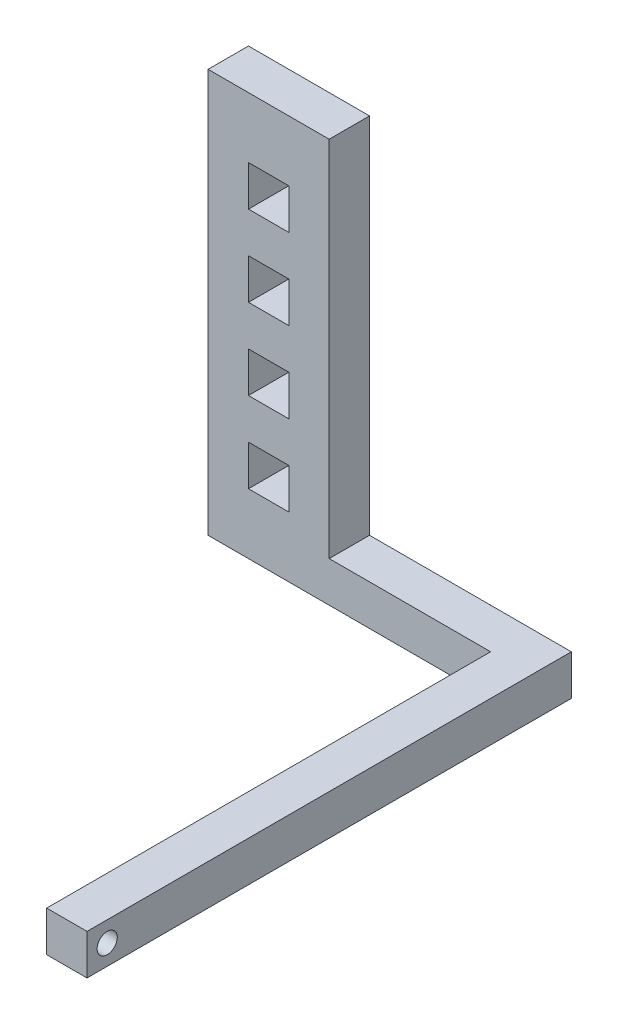
ISO-10303-21;
HEADER;
FILE_DESCRIPTION(('STEP AP214'),'2;1');
FILE_NAME('part.step','',(''),(''),'','','');
FILE_SCHEMA(('AUTOMOTIVE_DESIGN { 1 0 10303 214 1 1 1 1 }'));
ENDSEC;
DATA;
#1=APPLICATION_CONTEXT('core data for automotive mechanical design processes');
#2=APPLICATION_PROTOCOL_DEFINITION('international standard','automotive_design',2000,#1);
#3=PRODUCT_CONTEXT('',#1,'mechanical');
#4=PRODUCT('Part','Part','',(#3));
#5=PRODUCT_RELATED_PRODUCT_CATEGORY('part','',(#4));
#6=PRODUCT_DEFINITION_FORMATION('','',#4);
#7=PRODUCT_DEFINITION_CONTEXT('part definition',#1,'design');
#8=PRODUCT_DEFINITION('design','',#6,#7);
#9=PRODUCT_DEFINITION_SHAPE('','',#8);
#10=(LENGTH_UNIT() NAMED_UNIT(*) SI_UNIT(.MILLI.,.METRE.));
#11=(NAMED_UNIT(*) PLANE_ANGLE_UNIT() SI_UNIT($,.RADIAN.));
#12=(NAMED_UNIT(*) SI_UNIT($,.STERADIAN.) SOLID_ANGLE_UNIT());
#13=UNCERTAINTY_MEASURE_WITH_UNIT(LENGTH_MEASURE(1.E-05),#10,'distance_accuracy_value','');
#14=(GEOMETRIC_REPRESENTATION_CONTEXT(3) GLOBAL_UNCERTAINTY_ASSIGNED_CONTEXT((#13)) GLOBAL_UNIT_ASSIGNED_CONTEXT((#10,
#11,#12)) REPRESENTATION_CONTEXT('',''));
#15=CARTESIAN_POINT('',(0.,0.,0.));
#16=DIRECTION('',(0.,0.,1.));
#17=DIRECTION('',(1.,0.,0.));
#18=AXIS2_PLACEMENT_3D('',#15,#16,#17);
#19=CARTESIAN_POINT('',(15.,50.,10.));
#20=DIRECTION('',(-1.,0.,0.));
#21=DIRECTION('',(0.,0.,1.));
#22=AXIS2_PLACEMENT_3D('',#19,#20,#21);
#23=PLANE('',#22);
#24=DIRECTION('',(0.,0.,1.));
#25=VECTOR('',#24,1.);
#26=CARTESIAN_POINT('',(15.,-39.9860085630436,10.));
#27=LINE('',#26,#25);
#28=CARTESIAN_POINT('',(15.,-39.9860085630436,0.));
#29=VERTEX_POINT('',#28);
#30=CARTESIAN_POINT('',(15.,-39.9860085630436,10.));
#31=VERTEX_POINT('',#30);
#32=EDGE_CURVE('E239',#29,#31,#27,.T.);
#33=ORIENTED_EDGE('',*,*,#32,.F.);
#34=DIRECTION('',(0.,1.,0.));
#35=VECTOR('',#34,1.);
#36=CARTESIAN_POINT('',(15.,50.,0.));
#37=LINE('',#36,#35);
#38=CARTESIAN_POINT('',(15.,50.,0.));
#39=VERTEX_POINT('',#38);
#40=EDGE_CURVE('E296',#29,#39,#37,.T.);
#41=ORIENTED_EDGE('',*,*,#40,.T.);
#42=DIRECTION('',(0.,0.,-1.));
#43=VECTOR('',#42,1.);
#44=CARTESIAN_POINT('',(15.,50.,10.));
#45=LINE('',#44,#43);
#46=CARTESIAN_POINT('',(15.,50.,10.));
#47=VERTEX_POINT('',#46);
#48=EDGE_CURVE('E45',#47,#39,#45,.T.);
#49=ORIENTED_EDGE('',*,*,#48,.F.);
#50=DIRECTION('',(0.,1.,0.));
#51=VECTOR('',#50,1.);
#52=CARTESIAN_POINT('',(15.,50.,10.));
#53=LINE('',#52,#51);
#54=EDGE_CURVE('E255',#31,#47,#53,.T.);
#55=ORIENTED_EDGE('',*,*,#54,.F.);
#56=EDGE_LOOP('',(#33,#41,#49,#55));
#57=FACE_BOUND('',#56,.T.);
#58=ADVANCED_FACE('F35',(#57),#23,.F.);
#59=CARTESIAN_POINT('',(0.,0.,10.));
#60=DIRECTION('',(0.,0.,1.));
#61=DIRECTION('',(1.,0.,0.));
#62=AXIS2_PLACEMENT_3D('',#59,#60,#61);
#63=PLANE('',#62);
#64=DIRECTION('',(1.,0.,0.));
#65=VECTOR('',#64,1.);
#66=CARTESIAN_POINT('',(0.,-49.9860085630436,10.));
#67=LINE('',#66,#65);
#68=CARTESIAN_POINT('',(55.,-49.9860085630436,10.));
#69=VERTEX_POINT('',#68);
#70=CARTESIAN_POINT('',(65.,-49.9860085630436,10.));
#71=VERTEX_POINT('',#70);
#72=EDGE_CURVE('E234',#69,#71,#67,.T.);
#73=ORIENTED_EDGE('',*,*,#72,.F.);
#74=DIRECTION('',(0.,-1.,0.));
#75=VECTOR('',#74,1.);
#76=CARTESIAN_POINT('',(55.,0.,10.));
#77=LINE('',#76,#75);
#78=CARTESIAN_POINT('',(55.,-39.9860085630436,10.));
#79=VERTEX_POINT('',#78);
#80=EDGE_CURVE('E237',#79,#69,#77,.T.);
#81=ORIENTED_EDGE('',*,*,#80,.F.);
#82=DIRECTION('',(-1.,0.,0.));
#83=VECTOR('',#82,1.);
#84=CARTESIAN_POINT('',(65.,-39.9860085630436,10.));
#85=LINE('',#84,#83);
#86=EDGE_CURVE('E39',#79,#31,#85,.T.);
#87=ORIENTED_EDGE('',*,*,#86,.T.);
#88=ORIENTED_EDGE('',*,*,#54,.T.);
#89=DIRECTION('',(-1.,0.,0.));
#90=VECTOR('',#89,1.);
#91=CARTESIAN_POINT('',(-15.,50.,10.));
#92=LINE('',#91,#90);
#93=CARTESIAN_POINT('',(-15.,50.,10.));
#94=VERTEX_POINT('',#93);
#95=EDGE_CURVE('E275',#47,#94,#92,.T.);
#96=ORIENTED_EDGE('',*,*,#95,.T.);
#97=DIRECTION('',(0.,-1.,0.));
#98=VECTOR('',#97,1.);
#99=CARTESIAN_POINT('',(-15.,50.,10.));
#100=LINE('',#99,#98);
#101=CARTESIAN_POINT('',(-15.,-50.,10.));
#102=VERTEX_POINT('',#101);
#103=EDGE_CURVE('E280',#94,#102,#100,.T.);
#104=ORIENTED_EDGE('',*,*,#103,.T.);
#105=DIRECTION('',(1.,0.,0.));
#106=VECTOR('',#105,1.);
#107=CARTESIAN_POINT('',(-15.,-50.,10.));
#108=LINE('',#107,#106);
#109=CARTESIAN_POINT('',(65.,-50.,10.));
#110=VERTEX_POINT('',#109);
#111=EDGE_CURVE('E276',#102,#110,#108,.T.);
#112=ORIENTED_EDGE('',*,*,#111,.T.);
#113=DIRECTION('',(0.,-1.,0.));
#114=VECTOR('',#113,1.);
#115=CARTESIAN_POINT('',(65.,-50.,10.));
#116=LINE('',#115,#114);
#117=EDGE_CURVE('E240',#71,#110,#116,.T.);
#118=ORIENTED_EDGE('',*,*,#117,.F.);
#119=EDGE_LOOP('',(#73,#81,#87,#88,#96,#104,#112,#118));
#120=FACE_BOUND('',#119,.T.);
#121=DIRECTION('',(1.,0.,0.));
#122=VECTOR('',#121,1.);
#123=CARTESIAN_POINT('',(-5.,25.,10.));
#124=LINE('',#123,#122);
#125=CARTESIAN_POINT('',(-5.,25.,10.));
#126=VERTEX_POINT('',#125);
#127=CARTESIAN_POINT('',(5.,25.,10.));
#128=VERTEX_POINT('',#127);
#129=EDGE_CURVE('E690',#126,#128,#124,.T.);
#130=ORIENTED_EDGE('',*,*,#129,.F.);
#131=DIRECTION('',(0.,-1.,0.));
#132=VECTOR('',#131,1.);
#133=CARTESIAN_POINT('',(-5.,35.,10.));
#134=LINE('',#133,#132);
#135=CARTESIAN_POINT('',(-5.,35.,10.));
#136=VERTEX_POINT('',#135);
#137=EDGE_CURVE('E688',#136,#126,#134,.T.);
#138=ORIENTED_EDGE('',*,*,#137,.F.);
#139=DIRECTION('',(-1.,0.,0.));
#140=VECTOR('',#139,1.);
#141=CARTESIAN_POINT('',(-5.,35.,10.));
#142=LINE('',#141,#140);
#143=CARTESIAN_POINT('',(5.,35.,10.));
#144=VERTEX_POINT('',#143);
#145=EDGE_CURVE('E696',#144,#136,#142,.T.);
#146=ORIENTED_EDGE('',*,*,#145,.F.);
#147=DIRECTION('',(0.,1.,0.));
#148=VECTOR('',#147,1.);
#149=CARTESIAN_POINT('',(5.,35.,10.));
#150=LINE('',#149,#148);
#151=EDGE_CURVE('E693',#128,#144,#150,.T.);
#152=ORIENTED_EDGE('',*,*,#151,.F.);
#153=EDGE_LOOP('',(#130,#138,#146,#152));
#154=FACE_BOUND('',#153,.T.);
#155=DIRECTION('',(1.,0.,0.));
#156=VECTOR('',#155,1.);
#157=CARTESIAN_POINT('',(-4.99999999999979,5.,10.));
#158=LINE('',#157,#156);
#159=CARTESIAN_POINT('',(-4.99999999999979,5.,10.));
#160=VERTEX_POINT('',#159);
#161=CARTESIAN_POINT('',(5.00000000000021,5.,10.));
#162=VERTEX_POINT('',#161);
#163=EDGE_CURVE('E659',#160,#162,#158,.T.);
#164=ORIENTED_EDGE('',*,*,#163,.F.);
#165=DIRECTION('',(0.,-1.,0.));
#166=VECTOR('',#165,1.);
#167=CARTESIAN_POINT('',(-4.99999999999979,15.,10.));
#168=LINE('',#167,#166);
#169=CARTESIAN_POINT('',(-4.99999999999979,15.,10.));
#170=VERTEX_POINT('',#169);
#171=EDGE_CURVE('E657',#170,#160,#168,.T.);
#172=ORIENTED_EDGE('',*,*,#171,.F.);
#173=DIRECTION('',(-1.,0.,0.));
#174=VECTOR('',#173,1.);
#175=CARTESIAN_POINT('',(-4.99999999999979,15.,10.));
#176=LINE('',#175,#174);
#177=CARTESIAN_POINT('',(5.00000000000021,15.,10.));
#178=VERTEX_POINT('',#177);
#179=EDGE_CURVE('E665',#178,#170,#176,.T.);
#180=ORIENTED_EDGE('',*,*,#179,.F.);
#181=DIRECTION('',(0.,1.,0.));
#182=VECTOR('',#181,1.);
#183=CARTESIAN_POINT('',(5.00000000000021,15.,10.));
#184=LINE('',#183,#182);
#185=EDGE_CURVE('E662',#162,#178,#184,.T.);
#186=ORIENTED_EDGE('',*,*,#185,.F.);
#187=EDGE_LOOP('',(#164,#172,#180,#186));
#188=FACE_BOUND('',#187,.T.);
#189=DIRECTION('',(1.,0.,0.));
#190=VECTOR('',#189,1.);
#191=CARTESIAN_POINT('',(-4.99999999999958,-15.,10.));
#192=LINE('',#191,#190);
#193=CARTESIAN_POINT('',(-4.99999999999958,-15.,10.));
#194=VERTEX_POINT('',#193);
#195=CARTESIAN_POINT('',(5.00000000000042,-15.,10.));
#196=VERTEX_POINT('',#195);
#197=EDGE_CURVE('E628',#194,#196,#192,.T.);
#198=ORIENTED_EDGE('',*,*,#197,.F.);
#199=DIRECTION('',(0.,-1.,0.));
#200=VECTOR('',#199,1.);
#201=CARTESIAN_POINT('',(-4.99999999999958,-5.,10.));
#202=LINE('',#201,#200);
#203=CARTESIAN_POINT('',(-4.99999999999958,-5.,10.));
#204=VERTEX_POINT('',#203);
#205=EDGE_CURVE('E626',#204,#194,#202,.T.);
#206=ORIENTED_EDGE('',*,*,#205,.F.);
#207=DIRECTION('',(-1.,0.,0.));
#208=VECTOR('',#207,1.);
#209=CARTESIAN_POINT('',(-4.99999999999958,-5.,10.));
#210=LINE('',#209,#208);
#211=CARTESIAN_POINT('',(5.00000000000042,-5.,10.));
#212=VERTEX_POINT('',#211);
#213=EDGE_CURVE('E634',#212,#204,#210,.T.);
#214=ORIENTED_EDGE('',*,*,#213,.F.);
#215=DIRECTION('',(0.,1.,0.));
#216=VECTOR('',#215,1.);
#217=CARTESIAN_POINT('',(5.00000000000042,-5.,10.));
#218=LINE('',#217,#216);
#219=EDGE_CURVE('E631',#196,#212,#218,.T.);
#220=ORIENTED_EDGE('',*,*,#219,.F.);
#221=EDGE_LOOP('',(#198,#206,#214,#220));
#222=FACE_BOUND('',#221,.T.);
#223=DIRECTION('',(1.,0.,0.));
#224=VECTOR('',#223,1.);
#225=CARTESIAN_POINT('',(-4.99999999999937,-35.,10.));
#226=LINE('',#225,#224);
#227=CARTESIAN_POINT('',(-4.99999999999937,-35.,10.));
#228=VERTEX_POINT('',#227);
#229=CARTESIAN_POINT('',(5.00000000000063,-35.,10.));
#230=VERTEX_POINT('',#229);
#231=EDGE_CURVE('E738',#228,#230,#226,.T.);
#232=ORIENTED_EDGE('',*,*,#231,.F.);
#233=DIRECTION('',(0.,-1.,0.));
#234=VECTOR('',#233,1.);
#235=CARTESIAN_POINT('',(-4.99999999999937,-25.,10.));
#236=LINE('',#235,#234);
#237=CARTESIAN_POINT('',(-4.99999999999937,-25.,10.));
#238=VERTEX_POINT('',#237);
#239=EDGE_CURVE('E251',#238,#228,#236,.T.);
#240=ORIENTED_EDGE('',*,*,#239,.F.);
#241=DIRECTION('',(-1.,0.,0.));
#242=VECTOR('',#241,1.);
#243=CARTESIAN_POINT('',(-4.99999999999937,-25.,10.));
#244=LINE('',#243,#242);
#245=CARTESIAN_POINT('',(5.00000000000063,-25.,10.));
#246=VERTEX_POINT('',#245);
#247=EDGE_CURVE('E618',#246,#238,#244,.T.);
#248=ORIENTED_EDGE('',*,*,#247,.F.);
#249=DIRECTION('',(0.,1.,0.));
#250=VECTOR('',#249,1.);
#251=CARTESIAN_POINT('',(5.00000000000063,-25.,10.));
#252=LINE('',#251,#250);
#253=EDGE_CURVE('E740',#230,#246,#252,.T.);
#254=ORIENTED_EDGE('',*,*,#253,.F.);
#255=EDGE_LOOP('',(#232,#240,#248,#254));
#256=FACE_BOUND('',#255,.T.);
#257=ADVANCED_FACE('F268',(#120,#154,#188,#222,#256),#63,.T.);
#258=CARTESIAN_POINT('',(0.,0.,0.));
#259=DIRECTION('',(0.,0.,1.));
#260=DIRECTION('',(1.,0.,0.));
#261=AXIS2_PLACEMENT_3D('',#258,#259,#260);
#262=PLANE('',#261);
#263=DIRECTION('',(-1.,0.,0.));
#264=VECTOR('',#263,1.);
#265=CARTESIAN_POINT('',(65.,-39.9860085630436,0.));
#266=LINE('',#265,#264);
#267=CARTESIAN_POINT('',(65.,-39.9860085630436,0.));
#268=VERTEX_POINT('',#267);
#269=EDGE_CURVE('E61',#268,#29,#266,.T.);
#270=ORIENTED_EDGE('',*,*,#269,.F.);
#271=DIRECTION('',(0.,1.,0.));
#272=VECTOR('',#271,1.);
#273=CARTESIAN_POINT('',(65.,-50.,0.));
#274=LINE('',#273,#272);
#275=CARTESIAN_POINT('',(65.,-50.,0.));
#276=VERTEX_POINT('',#275);
#277=EDGE_CURVE('E245',#276,#268,#274,.T.);
#278=ORIENTED_EDGE('',*,*,#277,.F.);
#279=DIRECTION('',(1.,0.,0.));
#280=VECTOR('',#279,1.);
#281=CARTESIAN_POINT('',(-15.,-50.,0.));
#282=LINE('',#281,#280);
#283=CARTESIAN_POINT('',(-15.,-50.,0.));
#284=VERTEX_POINT('',#283);
#285=EDGE_CURVE('E293',#284,#276,#282,.T.);
#286=ORIENTED_EDGE('',*,*,#285,.F.);
#287=DIRECTION('',(0.,-1.,0.));
#288=VECTOR('',#287,1.);
#289=CARTESIAN_POINT('',(-15.,50.,0.));
#290=LINE('',#289,#288);
#291=CARTESIAN_POINT('',(-15.,50.,0.));
#292=VERTEX_POINT('',#291);
#293=EDGE_CURVE('E290',#292,#284,#290,.T.);
#294=ORIENTED_EDGE('',*,*,#293,.F.);
#295=DIRECTION('',(-1.,0.,0.));
#296=VECTOR('',#295,1.);
#297=CARTESIAN_POINT('',(-15.,50.,0.));
#298=LINE('',#297,#296);
#299=EDGE_CURVE('E285',#39,#292,#298,.T.);
#300=ORIENTED_EDGE('',*,*,#299,.F.);
#301=ORIENTED_EDGE('',*,*,#40,.F.);
#302=EDGE_LOOP('',(#270,#278,#286,#294,#300,#301));
#303=FACE_BOUND('',#302,.T.);
#304=DIRECTION('',(0.,-1.,0.));
#305=VECTOR('',#304,1.);
#306=CARTESIAN_POINT('',(-4.99999999999958,-5.,0.));
#307=LINE('',#306,#305);
#308=CARTESIAN_POINT('',(-4.99999999999958,-5.,0.));
#309=VERTEX_POINT('',#308);
#310=CARTESIAN_POINT('',(-4.99999999999958,-15.,0.));
#311=VERTEX_POINT('',#310);
#312=EDGE_CURVE('E625',#309,#311,#307,.T.);
#313=ORIENTED_EDGE('',*,*,#312,.T.);
#314=DIRECTION('',(1.,0.,0.));
#315=VECTOR('',#314,1.);
#316=CARTESIAN_POINT('',(-4.99999999999958,-15.,0.));
#317=LINE('',#316,#315);
#318=CARTESIAN_POINT('',(5.00000000000042,-15.,0.));
#319=VERTEX_POINT('',#318);
#320=EDGE_CURVE('E639',#311,#319,#317,.T.);
#321=ORIENTED_EDGE('',*,*,#320,.T.);
#322=DIRECTION('',(0.,1.,0.));
#323=VECTOR('',#322,1.);
#324=CARTESIAN_POINT('',(5.00000000000042,-5.,0.));
#325=LINE('',#324,#323);
#326=CARTESIAN_POINT('',(5.00000000000042,-5.,0.));
#327=VERTEX_POINT('',#326);
#328=EDGE_CURVE('E642',#319,#327,#325,.T.);
#329=ORIENTED_EDGE('',*,*,#328,.T.);
#330=DIRECTION('',(-1.,0.,0.));
#331=VECTOR('',#330,1.);
#332=CARTESIAN_POINT('',(-4.99999999999958,-5.,0.));
#333=LINE('',#332,#331);
#334=EDGE_CURVE('E629',#327,#309,#333,.T.);
#335=ORIENTED_EDGE('',*,*,#334,.T.);
#336=EDGE_LOOP('',(#313,#321,#329,#335));
#337=FACE_BOUND('',#336,.T.);
#338=DIRECTION('',(0.,-1.,0.));
#339=VECTOR('',#338,1.);
#340=CARTESIAN_POINT('',(-5.,35.,0.));
#341=LINE('',#340,#339);
#342=CARTESIAN_POINT('',(-5.,35.,0.));
#343=VERTEX_POINT('',#342);
#344=CARTESIAN_POINT('',(-5.,25.,0.));
#345=VERTEX_POINT('',#344);
#346=EDGE_CURVE('E687',#343,#345,#341,.T.);
#347=ORIENTED_EDGE('',*,*,#346,.T.);
#348=DIRECTION('',(1.,0.,0.));
#349=VECTOR('',#348,1.);
#350=CARTESIAN_POINT('',(-5.,25.,0.));
#351=LINE('',#350,#349);
#352=CARTESIAN_POINT('',(5.,25.,0.));
#353=VERTEX_POINT('',#352);
#354=EDGE_CURVE('E701',#345,#353,#351,.T.);
#355=ORIENTED_EDGE('',*,*,#354,.T.);
#356=DIRECTION('',(0.,1.,0.));
#357=VECTOR('',#356,1.);
#358=CARTESIAN_POINT('',(5.,35.,0.));
#359=LINE('',#358,#357);
#360=CARTESIAN_POINT('',(5.,35.,0.));
#361=VERTEX_POINT('',#360);
#362=EDGE_CURVE('E704',#353,#361,#359,.T.);
#363=ORIENTED_EDGE('',*,*,#362,.T.);
#364=DIRECTION('',(-1.,0.,0.));
#365=VECTOR('',#364,1.);
#366=CARTESIAN_POINT('',(-5.,35.,0.));
#367=LINE('',#366,#365);
#368=EDGE_CURVE('E691',#361,#343,#367,.T.);
#369=ORIENTED_EDGE('',*,*,#368,.T.);
#370=EDGE_LOOP('',(#347,#355,#363,#369));
#371=FACE_BOUND('',#370,.T.);
#372=DIRECTION('',(0.,-1.,0.));
#373=VECTOR('',#372,1.);
#374=CARTESIAN_POINT('',(-4.99999999999979,15.,0.));
#375=LINE('',#374,#373);
#376=CARTESIAN_POINT('',(-4.99999999999979,15.,0.));
#377=VERTEX_POINT('',#376);
#378=CARTESIAN_POINT('',(-4.99999999999979,5.,0.));
#379=VERTEX_POINT('',#378);
#380=EDGE_CURVE('E656',#377,#379,#375,.T.);
#381=ORIENTED_EDGE('',*,*,#380,.T.);
#382=DIRECTION('',(1.,0.,0.));
#383=VECTOR('',#382,1.);
#384=CARTESIAN_POINT('',(-4.99999999999979,5.,0.));
#385=LINE('',#384,#383);
#386=CARTESIAN_POINT('',(5.00000000000021,5.,0.));
#387=VERTEX_POINT('',#386);
#388=EDGE_CURVE('E670',#379,#387,#385,.T.);
#389=ORIENTED_EDGE('',*,*,#388,.T.);
#390=DIRECTION('',(0.,1.,0.));
#391=VECTOR('',#390,1.);
#392=CARTESIAN_POINT('',(5.00000000000021,15.,0.));
#393=LINE('',#392,#391);
#394=CARTESIAN_POINT('',(5.00000000000021,15.,0.));
#395=VERTEX_POINT('',#394);
#396=EDGE_CURVE('E673',#387,#395,#393,.T.);
#397=ORIENTED_EDGE('',*,*,#396,.T.);
#398=DIRECTION('',(-1.,0.,0.));
#399=VECTOR('',#398,1.);
#400=CARTESIAN_POINT('',(-4.99999999999979,15.,0.));
#401=LINE('',#400,#399);
#402=EDGE_CURVE('E660',#395,#377,#401,.T.);
#403=ORIENTED_EDGE('',*,*,#402,.T.);
#404=EDGE_LOOP('',(#381,#389,#397,#403));
#405=FACE_BOUND('',#404,.T.);
#406=DIRECTION('',(0.,-1.,0.));
#407=VECTOR('',#406,1.);
#408=CARTESIAN_POINT('',(-4.99999999999937,-25.,0.));
#409=LINE('',#408,#407);
#410=CARTESIAN_POINT('',(-4.99999999999937,-25.,0.));
#411=VERTEX_POINT('',#410);
#412=CARTESIAN_POINT('',(-4.99999999999937,-35.,0.));
#413=VERTEX_POINT('',#412);
#414=EDGE_CURVE('E260',#411,#413,#409,.T.);
#415=ORIENTED_EDGE('',*,*,#414,.T.);
#416=DIRECTION('',(1.,0.,0.));
#417=VECTOR('',#416,1.);
#418=CARTESIAN_POINT('',(-4.99999999999937,-35.,0.));
#419=LINE('',#418,#417);
#420=CARTESIAN_POINT('',(5.00000000000063,-35.,0.));
#421=VERTEX_POINT('',#420);
#422=EDGE_CURVE('E263',#413,#421,#419,.T.);
#423=ORIENTED_EDGE('',*,*,#422,.T.);
#424=DIRECTION('',(0.,1.,0.));
#425=VECTOR('',#424,1.);
#426=CARTESIAN_POINT('',(5.00000000000063,-25.,0.));
#427=LINE('',#426,#425);
#428=CARTESIAN_POINT('',(5.00000000000063,-25.,0.));
#429=VERTEX_POINT('',#428);
#430=EDGE_CURVE('E609',#421,#429,#427,.T.);
#431=ORIENTED_EDGE('',*,*,#430,.T.);
#432=DIRECTION('',(-1.,0.,0.));
#433=VECTOR('',#432,1.);
#434=CARTESIAN_POINT('',(-4.99999999999937,-25.,0.));
#435=LINE('',#434,#433);
#436=EDGE_CURVE('E602',#429,#411,#435,.T.);
#437=ORIENTED_EDGE('',*,*,#436,.T.);
#438=EDGE_LOOP('',(#415,#423,#431,#437));
#439=FACE_BOUND('',#438,.T.);
#440=ADVANCED_FACE('F310',(#303,#337,#371,#405,#439),#262,.F.);
#441=CARTESIAN_POINT('',(-15.,50.,10.));
#442=DIRECTION('',(1.,0.,0.));
#443=DIRECTION('',(0.,0.,-1.));
#444=AXIS2_PLACEMENT_3D('',#441,#442,#443);
#445=PLANE('',#444);
#446=ORIENTED_EDGE('',*,*,#293,.T.);
#447=DIRECTION('',(0.,0.,-1.));
#448=VECTOR('',#447,1.);
#449=CARTESIAN_POINT('',(-15.,-50.,10.));
#450=LINE('',#449,#448);
#451=EDGE_CURVE('E11',#102,#284,#450,.T.);
#452=ORIENTED_EDGE('',*,*,#451,.F.);
#453=ORIENTED_EDGE('',*,*,#103,.F.);
#454=DIRECTION('',(0.,0.,-1.));
#455=VECTOR('',#454,1.);
#456=CARTESIAN_POINT('',(-15.,50.,10.));
#457=LINE('',#456,#455);
#458=EDGE_CURVE('E277',#94,#292,#457,.T.);
#459=ORIENTED_EDGE('',*,*,#458,.T.);
#460=EDGE_LOOP('',(#446,#452,#453,#459));
#461=FACE_BOUND('',#460,.T.);
#462=ADVANCED_FACE('F37',(#461),#445,.F.);
#463=CARTESIAN_POINT('',(-15.,-50.,10.));
#464=DIRECTION('',(0.,1.,0.));
#465=DIRECTION('',(0.,0.,1.));
#466=AXIS2_PLACEMENT_3D('',#463,#464,#465);
#467=PLANE('',#466);
#468=ORIENTED_EDGE('',*,*,#285,.T.);
#469=DIRECTION('',(0.,0.,-1.));
#470=VECTOR('',#469,1.);
#471=CARTESIAN_POINT('',(65.,-50.,10.));
#472=LINE('',#471,#470);
#473=EDGE_CURVE('E242',#110,#276,#472,.T.);
#474=ORIENTED_EDGE('',*,*,#473,.F.);
#475=ORIENTED_EDGE('',*,*,#111,.F.);
#476=ORIENTED_EDGE('',*,*,#451,.T.);
#477=EDGE_LOOP('',(#468,#474,#475,#476));
#478=FACE_BOUND('',#477,.T.);
#479=ADVANCED_FACE('F314',(#478),#467,.F.);
#480=CARTESIAN_POINT('',(-15.,50.,10.));
#481=DIRECTION('',(0.,-1.,0.));
#482=DIRECTION('',(0.,0.,-1.));
#483=AXIS2_PLACEMENT_3D('',#480,#481,#482);
#484=PLANE('',#483);
#485=ORIENTED_EDGE('',*,*,#299,.T.);
#486=ORIENTED_EDGE('',*,*,#458,.F.);
#487=ORIENTED_EDGE('',*,*,#95,.F.);
#488=ORIENTED_EDGE('',*,*,#48,.T.);
#489=EDGE_LOOP('',(#485,#486,#487,#488));
#490=FACE_BOUND('',#489,.T.);
#491=ADVANCED_FACE('F315',(#490),#484,.F.);
#492=CARTESIAN_POINT('',(-5.,35.,10.));
#493=DIRECTION('',(1.,0.,0.));
#494=DIRECTION('',(0.,1.,0.));
#495=AXIS2_PLACEMENT_3D('',#492,#493,#494);
#496=PLANE('',#495);
#497=ORIENTED_EDGE('',*,*,#346,.F.);
#498=DIRECTION('',(0.,0.,-1.));
#499=VECTOR('',#498,1.);
#500=CARTESIAN_POINT('',(-5.,35.,10.));
#501=LINE('',#500,#499);
#502=EDGE_CURVE('E698',#136,#343,#501,.T.);
#503=ORIENTED_EDGE('',*,*,#502,.F.);
#504=ORIENTED_EDGE('',*,*,#137,.T.);
#505=DIRECTION('',(0.,0.,-1.));
#506=VECTOR('',#505,1.);
#507=CARTESIAN_POINT('',(-5.,25.,10.));
#508=LINE('',#507,#506);
#509=EDGE_CURVE('E294',#126,#345,#508,.T.);
#510=ORIENTED_EDGE('',*,*,#509,.T.);
#511=EDGE_LOOP('',(#497,#503,#504,#510));
#512=FACE_BOUND('',#511,.T.);
#513=ADVANCED_FACE('F317',(#512),#496,.T.);
#514=CARTESIAN_POINT('',(-5.,25.,10.));
#515=DIRECTION('',(0.,1.,0.));
#516=DIRECTION('',(0.,0.,1.));
#517=AXIS2_PLACEMENT_3D('',#514,#515,#516);
#518=PLANE('',#517);
#519=ORIENTED_EDGE('',*,*,#354,.F.);
#520=ORIENTED_EDGE('',*,*,#509,.F.);
#521=ORIENTED_EDGE('',*,*,#129,.T.);
#522=DIRECTION('',(0.,0.,-1.));
#523=VECTOR('',#522,1.);
#524=CARTESIAN_POINT('',(5.,25.,10.));
#525=LINE('',#524,#523);
#526=EDGE_CURVE('E713',#128,#353,#525,.T.);
#527=ORIENTED_EDGE('',*,*,#526,.T.);
#528=EDGE_LOOP('',(#519,#520,#521,#527));
#529=FACE_BOUND('',#528,.T.);
#530=ADVANCED_FACE('F323',(#529),#518,.T.);
#531=CARTESIAN_POINT('',(5.,35.,10.));
#532=DIRECTION('',(-1.,0.,0.));
#533=DIRECTION('',(0.,-1.,0.));
#534=AXIS2_PLACEMENT_3D('',#531,#532,#533);
#535=PLANE('',#534);
#536=ORIENTED_EDGE('',*,*,#362,.F.);
#537=ORIENTED_EDGE('',*,*,#526,.F.);
#538=ORIENTED_EDGE('',*,*,#151,.T.);
#539=DIRECTION('',(0.,0.,-1.));
#540=VECTOR('',#539,1.);
#541=CARTESIAN_POINT('',(5.,35.,10.));
#542=LINE('',#541,#540);
#543=EDGE_CURVE('E711',#144,#361,#542,.T.);
#544=ORIENTED_EDGE('',*,*,#543,.T.);
#545=EDGE_LOOP('',(#536,#537,#538,#544));
#546=FACE_BOUND('',#545,.T.);
#547=ADVANCED_FACE('F343',(#546),#535,.T.);
#548=CARTESIAN_POINT('',(-5.,35.,10.));
#549=DIRECTION('',(0.,-1.,0.));
#550=DIRECTION('',(0.,0.,-1.));
#551=AXIS2_PLACEMENT_3D('',#548,#549,#550);
#552=PLANE('',#551);
#553=ORIENTED_EDGE('',*,*,#368,.F.);
#554=ORIENTED_EDGE('',*,*,#543,.F.);
#555=ORIENTED_EDGE('',*,*,#145,.T.);
#556=ORIENTED_EDGE('',*,*,#502,.T.);
#557=EDGE_LOOP('',(#553,#554,#555,#556));
#558=FACE_BOUND('',#557,.T.);
#559=ADVANCED_FACE('F347',(#558),#552,.T.);
#560=CARTESIAN_POINT('',(-4.99999999999979,15.,10.));
#561=DIRECTION('',(1.,0.,0.));
#562=DIRECTION('',(0.,1.,0.));
#563=AXIS2_PLACEMENT_3D('',#560,#561,#562);
#564=PLANE('',#563);
#565=ORIENTED_EDGE('',*,*,#380,.F.);
#566=DIRECTION('',(0.,0.,-1.));
#567=VECTOR('',#566,1.);
#568=CARTESIAN_POINT('',(-4.99999999999979,15.,10.));
#569=LINE('',#568,#567);
#570=EDGE_CURVE('E667',#170,#377,#569,.T.);
#571=ORIENTED_EDGE('',*,*,#570,.F.);
#572=ORIENTED_EDGE('',*,*,#171,.T.);
#573=DIRECTION('',(0.,0.,-1.));
#574=VECTOR('',#573,1.);
#575=CARTESIAN_POINT('',(-4.99999999999979,5.,10.));
#576=LINE('',#575,#574);
#577=EDGE_CURVE('E684',#160,#379,#576,.T.);
#578=ORIENTED_EDGE('',*,*,#577,.T.);
#579=EDGE_LOOP('',(#565,#571,#572,#578));
#580=FACE_BOUND('',#579,.T.);
#581=ADVANCED_FACE('F351',(#580),#564,.T.);
#582=CARTESIAN_POINT('',(-4.99999999999979,5.,10.));
#583=DIRECTION('',(0.,1.,0.));
#584=DIRECTION('',(0.,0.,1.));
#585=AXIS2_PLACEMENT_3D('',#582,#583,#584);
#586=PLANE('',#585);
#587=ORIENTED_EDGE('',*,*,#388,.F.);
#588=ORIENTED_EDGE('',*,*,#577,.F.);
#589=ORIENTED_EDGE('',*,*,#163,.T.);
#590=DIRECTION('',(0.,0.,-1.));
#591=VECTOR('',#590,1.);
#592=CARTESIAN_POINT('',(5.00000000000021,5.,10.));
#593=LINE('',#592,#591);
#594=EDGE_CURVE('E682',#162,#387,#593,.T.);
#595=ORIENTED_EDGE('',*,*,#594,.T.);
#596=EDGE_LOOP('',(#587,#588,#589,#595));
#597=FACE_BOUND('',#596,.T.);
#598=ADVANCED_FACE('F355',(#597),#586,.T.);
#599=CARTESIAN_POINT('',(5.00000000000021,15.,10.));
#600=DIRECTION('',(-1.,0.,0.));
#601=DIRECTION('',(0.,-1.,0.));
#602=AXIS2_PLACEMENT_3D('',#599,#600,#601);
#603=PLANE('',#602);
#604=ORIENTED_EDGE('',*,*,#396,.F.);
#605=ORIENTED_EDGE('',*,*,#594,.F.);
#606=ORIENTED_EDGE('',*,*,#185,.T.);
#607=DIRECTION('',(0.,0.,-1.));
#608=VECTOR('',#607,1.);
#609=CARTESIAN_POINT('',(5.00000000000021,15.,10.));
#610=LINE('',#609,#608);
#611=EDGE_CURVE('E680',#178,#395,#610,.T.);
#612=ORIENTED_EDGE('',*,*,#611,.T.);
#613=EDGE_LOOP('',(#604,#605,#606,#612));
#614=FACE_BOUND('',#613,.T.);
#615=ADVANCED_FACE('F359',(#614),#603,.T.);
#616=CARTESIAN_POINT('',(-4.99999999999979,15.,10.));
#617=DIRECTION('',(0.,-1.,0.));
#618=DIRECTION('',(0.,0.,-1.));
#619=AXIS2_PLACEMENT_3D('',#616,#617,#618);
#620=PLANE('',#619);
#621=ORIENTED_EDGE('',*,*,#402,.F.);
#622=ORIENTED_EDGE('',*,*,#611,.F.);
#623=ORIENTED_EDGE('',*,*,#179,.T.);
#624=ORIENTED_EDGE('',*,*,#570,.T.);
#625=EDGE_LOOP('',(#621,#622,#623,#624));
#626=FACE_BOUND('',#625,.T.);
#627=ADVANCED_FACE('F363',(#626),#620,.T.);
#628=CARTESIAN_POINT('',(-4.99999999999958,-5.,10.));
#629=DIRECTION('',(1.,0.,0.));
#630=DIRECTION('',(0.,1.,0.));
#631=AXIS2_PLACEMENT_3D('',#628,#629,#630);
#632=PLANE('',#631);
#633=ORIENTED_EDGE('',*,*,#312,.F.);
#634=DIRECTION('',(0.,0.,-1.));
#635=VECTOR('',#634,1.);
#636=CARTESIAN_POINT('',(-4.99999999999958,-5.,10.));
#637=LINE('',#636,#635);
#638=EDGE_CURVE('E636',#204,#309,#637,.T.);
#639=ORIENTED_EDGE('',*,*,#638,.F.);
#640=ORIENTED_EDGE('',*,*,#205,.T.);
#641=DIRECTION('',(0.,0.,-1.));
#642=VECTOR('',#641,1.);
#643=CARTESIAN_POINT('',(-4.99999999999958,-15.,10.));
#644=LINE('',#643,#642);
#645=EDGE_CURVE('E653',#194,#311,#644,.T.);
#646=ORIENTED_EDGE('',*,*,#645,.T.);
#647=EDGE_LOOP('',(#633,#639,#640,#646));
#648=FACE_BOUND('',#647,.T.);
#649=ADVANCED_FACE('F367',(#648),#632,.T.);
#650=CARTESIAN_POINT('',(-4.99999999999958,-15.,10.));
#651=DIRECTION('',(0.,1.,0.));
#652=DIRECTION('',(0.,0.,1.));
#653=AXIS2_PLACEMENT_3D('',#650,#651,#652);
#654=PLANE('',#653);
#655=ORIENTED_EDGE('',*,*,#320,.F.);
#656=ORIENTED_EDGE('',*,*,#645,.F.);
#657=ORIENTED_EDGE('',*,*,#197,.T.);
#658=DIRECTION('',(0.,0.,-1.));
#659=VECTOR('',#658,1.);
#660=CARTESIAN_POINT('',(5.00000000000042,-15.,10.));
#661=LINE('',#660,#659);
#662=EDGE_CURVE('E651',#196,#319,#661,.T.);
#663=ORIENTED_EDGE('',*,*,#662,.T.);
#664=EDGE_LOOP('',(#655,#656,#657,#663));
#665=FACE_BOUND('',#664,.T.);
#666=ADVANCED_FACE('F371',(#665),#654,.T.);
#667=CARTESIAN_POINT('',(5.00000000000042,-5.,10.));
#668=DIRECTION('',(-1.,0.,0.));
#669=DIRECTION('',(0.,-1.,0.));
#670=AXIS2_PLACEMENT_3D('',#667,#668,#669);
#671=PLANE('',#670);
#672=ORIENTED_EDGE('',*,*,#328,.F.);
#673=ORIENTED_EDGE('',*,*,#662,.F.);
#674=ORIENTED_EDGE('',*,*,#219,.T.);
#675=DIRECTION('',(0.,0.,-1.));
#676=VECTOR('',#675,1.);
#677=CARTESIAN_POINT('',(5.00000000000042,-5.,10.));
#678=LINE('',#677,#676);
#679=EDGE_CURVE('E649',#212,#327,#678,.T.);
#680=ORIENTED_EDGE('',*,*,#679,.T.);
#681=EDGE_LOOP('',(#672,#673,#674,#680));
#682=FACE_BOUND('',#681,.T.);
#683=ADVANCED_FACE('F375',(#682),#671,.T.);
#684=CARTESIAN_POINT('',(-4.99999999999958,-5.,10.));
#685=DIRECTION('',(0.,-1.,0.));
#686=DIRECTION('',(0.,0.,-1.));
#687=AXIS2_PLACEMENT_3D('',#684,#685,#686);
#688=PLANE('',#687);
#689=ORIENTED_EDGE('',*,*,#334,.F.);
#690=ORIENTED_EDGE('',*,*,#679,.F.);
#691=ORIENTED_EDGE('',*,*,#213,.T.);
#692=ORIENTED_EDGE('',*,*,#638,.T.);
#693=EDGE_LOOP('',(#689,#690,#691,#692));
#694=FACE_BOUND('',#693,.T.);
#695=ADVANCED_FACE('F379',(#694),#688,.T.);
#696=CARTESIAN_POINT('',(-4.99999999999937,-25.,10.));
#697=DIRECTION('',(1.,0.,0.));
#698=DIRECTION('',(0.,1.,0.));
#699=AXIS2_PLACEMENT_3D('',#696,#697,#698);
#700=PLANE('',#699);
#701=ORIENTED_EDGE('',*,*,#414,.F.);
#702=DIRECTION('',(0.,0.,-1.));
#703=VECTOR('',#702,1.);
#704=CARTESIAN_POINT('',(-4.99999999999937,-25.,10.));
#705=LINE('',#704,#703);
#706=EDGE_CURVE('E607',#238,#411,#705,.T.);
#707=ORIENTED_EDGE('',*,*,#706,.F.);
#708=ORIENTED_EDGE('',*,*,#239,.T.);
#709=DIRECTION('',(0.,0.,-1.));
#710=VECTOR('',#709,1.);
#711=CARTESIAN_POINT('',(-4.99999999999937,-35.,10.));
#712=LINE('',#711,#710);
#713=EDGE_CURVE('E622',#228,#413,#712,.T.);
#714=ORIENTED_EDGE('',*,*,#713,.T.);
#715=EDGE_LOOP('',(#701,#707,#708,#714));
#716=FACE_BOUND('',#715,.T.);
#717=ADVANCED_FACE('F383',(#716),#700,.T.);
#718=CARTESIAN_POINT('',(-4.99999999999937,-35.,10.));
#719=DIRECTION('',(0.,1.,0.));
#720=DIRECTION('',(0.,0.,1.));
#721=AXIS2_PLACEMENT_3D('',#718,#719,#720);
#722=PLANE('',#721);
#723=ORIENTED_EDGE('',*,*,#422,.F.);
#724=ORIENTED_EDGE('',*,*,#713,.F.);
#725=ORIENTED_EDGE('',*,*,#231,.T.);
#726=DIRECTION('',(0.,0.,-1.));
#727=VECTOR('',#726,1.);
#728=CARTESIAN_POINT('',(5.00000000000063,-35.,10.));
#729=LINE('',#728,#727);
#730=EDGE_CURVE('E620',#230,#421,#729,.T.);
#731=ORIENTED_EDGE('',*,*,#730,.T.);
#732=EDGE_LOOP('',(#723,#724,#725,#731));
#733=FACE_BOUND('',#732,.T.);
#734=ADVANCED_FACE('F387',(#733),#722,.T.);
#735=CARTESIAN_POINT('',(5.00000000000063,-25.,10.));
#736=DIRECTION('',(-1.,0.,0.));
#737=DIRECTION('',(0.,-1.,0.));
#738=AXIS2_PLACEMENT_3D('',#735,#736,#737);
#739=PLANE('',#738);
#740=ORIENTED_EDGE('',*,*,#430,.F.);
#741=ORIENTED_EDGE('',*,*,#730,.F.);
#742=ORIENTED_EDGE('',*,*,#253,.T.);
#743=DIRECTION('',(0.,0.,-1.));
#744=VECTOR('',#743,1.);
#745=CARTESIAN_POINT('',(5.00000000000063,-25.,10.));
#746=LINE('',#745,#744);
#747=EDGE_CURVE('E604',#246,#429,#746,.T.);
#748=ORIENTED_EDGE('',*,*,#747,.T.);
#749=EDGE_LOOP('',(#740,#741,#742,#748));
#750=FACE_BOUND('',#749,.T.);
#751=ADVANCED_FACE('F391',(#750),#739,.T.);
#752=CARTESIAN_POINT('',(-4.99999999999937,-25.,10.));
#753=DIRECTION('',(0.,-1.,0.));
#754=DIRECTION('',(0.,0.,-1.));
#755=AXIS2_PLACEMENT_3D('',#752,#753,#754);
#756=PLANE('',#755);
#757=ORIENTED_EDGE('',*,*,#436,.F.);
#758=ORIENTED_EDGE('',*,*,#747,.F.);
#759=ORIENTED_EDGE('',*,*,#247,.T.);
#760=ORIENTED_EDGE('',*,*,#706,.T.);
#761=EDGE_LOOP('',(#757,#758,#759,#760));
#762=FACE_BOUND('',#761,.T.);
#763=ADVANCED_FACE('F395',(#762),#756,.T.);
#764=CARTESIAN_POINT('',(65.,-39.9860085630436,10.));
#765=DIRECTION('',(0.,-1.,0.));
#766=DIRECTION('',(0.,0.,-1.));
#767=AXIS2_PLACEMENT_3D('',#764,#765,#766);
#768=PLANE('',#767);
#769=ORIENTED_EDGE('',*,*,#86,.F.);
#770=DIRECTION('',(0.,0.,1.));
#771=VECTOR('',#770,1.);
#772=CARTESIAN_POINT('',(55.,-39.9860085630436,0.));
#773=LINE('',#772,#771);
#774=CARTESIAN_POINT('',(55.,-39.9860085630436,120.));
#775=VERTEX_POINT('',#774);
#776=EDGE_CURVE('E207',#79,#775,#773,.T.);
#777=ORIENTED_EDGE('',*,*,#776,.T.);
#778=DIRECTION('',(1.,0.,0.));
#779=VECTOR('',#778,1.);
#780=CARTESIAN_POINT('',(55.,-39.9860085630436,120.));
#781=LINE('',#780,#779);
#782=CARTESIAN_POINT('',(65.,-39.9860085630436,120.));
#783=VERTEX_POINT('',#782);
#784=EDGE_CURVE('E210',#775,#783,#781,.T.);
#785=ORIENTED_EDGE('',*,*,#784,.T.);
#786=DIRECTION('',(0.,0.,1.));
#787=VECTOR('',#786,1.);
#788=CARTESIAN_POINT('',(65.,-39.9860085630436,10.));
#789=LINE('',#788,#787);
#790=EDGE_CURVE('E247',#268,#783,#789,.T.);
#791=ORIENTED_EDGE('',*,*,#790,.F.);
#792=ORIENTED_EDGE('',*,*,#269,.T.);
#793=ORIENTED_EDGE('',*,*,#32,.T.);
#794=EDGE_LOOP('',(#769,#777,#785,#791,#792,#793));
#795=FACE_BOUND('',#794,.T.);
#796=ADVANCED_FACE('F209',(#795),#768,.F.);
#797=CARTESIAN_POINT('',(65.,0.,0.));
#798=DIRECTION('',(-1.,0.,0.));
#799=DIRECTION('',(0.,0.,1.));
#800=AXIS2_PLACEMENT_3D('',#797,#798,#799);
#801=PLANE('',#800);
#802=ORIENTED_EDGE('',*,*,#277,.T.);
#803=ORIENTED_EDGE('',*,*,#790,.T.);
#804=DIRECTION('',(0.,-1.,0.));
#805=VECTOR('',#804,1.);
#806=CARTESIAN_POINT('',(65.,-39.9860085630436,120.));
#807=LINE('',#806,#805);
#808=CARTESIAN_POINT('',(65.,-49.9860085630436,120.));
#809=VERTEX_POINT('',#808);
#810=EDGE_CURVE('E221',#783,#809,#807,.T.);
#811=ORIENTED_EDGE('',*,*,#810,.T.);
#812=DIRECTION('',(0.,0.,-1.));
#813=VECTOR('',#812,1.);
#814=CARTESIAN_POINT('',(65.,-49.9860085630436,0.));
#815=LINE('',#814,#813);
#816=EDGE_CURVE('E53',#809,#71,#815,.T.);
#817=ORIENTED_EDGE('',*,*,#816,.T.);
#818=ORIENTED_EDGE('',*,*,#117,.T.);
#819=ORIENTED_EDGE('',*,*,#473,.T.);
#820=EDGE_LOOP('',(#802,#803,#811,#817,#818,#819));
#821=FACE_BOUND('',#820,.T.);
#822=CARTESIAN_POINT('',(65.,-44.9860085630436,115.));
#823=DIRECTION('',(1.,0.,0.));
#824=DIRECTION('',(0.,0.,-1.));
#825=AXIS2_PLACEMENT_3D('',#822,#823,#824);
#826=CIRCLE('',#825,2.5);
#827=CARTESIAN_POINT('',(65.,-44.9860085630436,112.5));
#828=VERTEX_POINT('',#827);
#829=EDGE_CURVE('E424',#828,#828,#826,.T.);
#830=ORIENTED_EDGE('',*,*,#829,.F.);
#831=EDGE_LOOP('',(#830));
#832=FACE_BOUND('',#831,.T.);
#833=ADVANCED_FACE('F402',(#821,#832),#801,.F.);
#834=CARTESIAN_POINT('',(55.,-49.9860085630436,0.));
#835=DIRECTION('',(0.,-1.,0.));
#836=DIRECTION('',(0.,0.,-1.));
#837=AXIS2_PLACEMENT_3D('',#834,#835,#836);
#838=PLANE('',#837);
#839=DIRECTION('',(0.,0.,-1.));
#840=VECTOR('',#839,1.);
#841=CARTESIAN_POINT('',(55.,-49.9860085630436,0.));
#842=LINE('',#841,#840);
#843=CARTESIAN_POINT('',(55.,-49.9860085630436,120.));
#844=VERTEX_POINT('',#843);
#845=EDGE_CURVE('E223',#844,#69,#842,.T.);
#846=ORIENTED_EDGE('',*,*,#845,.T.);
#847=ORIENTED_EDGE('',*,*,#72,.T.);
#848=ORIENTED_EDGE('',*,*,#816,.F.);
#849=DIRECTION('',(1.,0.,0.));
#850=VECTOR('',#849,1.);
#851=CARTESIAN_POINT('',(55.,-49.9860085630436,120.));
#852=LINE('',#851,#850);
#853=EDGE_CURVE('E222',#844,#809,#852,.T.);
#854=ORIENTED_EDGE('',*,*,#853,.F.);
#855=EDGE_LOOP('',(#846,#847,#848,#854));
#856=FACE_BOUND('',#855,.T.);
#857=ADVANCED_FACE('F405',(#856),#838,.T.);
#858=CARTESIAN_POINT('',(55.,-39.9860085630436,120.));
#859=DIRECTION('',(0.,0.,1.));
#860=DIRECTION('',(1.,0.,0.));
#861=AXIS2_PLACEMENT_3D('',#858,#859,#860);
#862=PLANE('',#861);
#863=ORIENTED_EDGE('',*,*,#810,.F.);
#864=ORIENTED_EDGE('',*,*,#784,.F.);
#865=DIRECTION('',(0.,-1.,0.));
#866=VECTOR('',#865,1.);
#867=CARTESIAN_POINT('',(55.,-39.9860085630436,120.));
#868=LINE('',#867,#866);
#869=EDGE_CURVE('E215',#775,#844,#868,.T.);
#870=ORIENTED_EDGE('',*,*,#869,.T.);
#871=ORIENTED_EDGE('',*,*,#853,.T.);
#872=EDGE_LOOP('',(#863,#864,#870,#871));
#873=FACE_BOUND('',#872,.T.);
#874=ADVANCED_FACE('F219',(#873),#862,.T.);
#875=CARTESIAN_POINT('',(55.,0.,0.));
#876=DIRECTION('',(-1.,0.,0.));
#877=DIRECTION('',(0.,0.,1.));
#878=AXIS2_PLACEMENT_3D('',#875,#876,#877);
#879=PLANE('',#878);
#880=CARTESIAN_POINT('',(55.,-44.9860085630436,115.));
#881=DIRECTION('',(1.,0.,0.));
#882=DIRECTION('',(0.,0.,-1.));
#883=AXIS2_PLACEMENT_3D('',#880,#881,#882);
#884=CIRCLE('',#883,2.5);
#885=CARTESIAN_POINT('',(55.,-44.9860085630436,112.5));
#886=VERTEX_POINT('',#885);
#887=EDGE_CURVE('E232',#886,#886,#884,.T.);
#888=ORIENTED_EDGE('',*,*,#887,.T.);
#889=EDGE_LOOP('',(#888));
#890=FACE_BOUND('',#889,.T.);
#891=ORIENTED_EDGE('',*,*,#776,.F.);
#892=ORIENTED_EDGE('',*,*,#80,.T.);
#893=ORIENTED_EDGE('',*,*,#845,.F.);
#894=ORIENTED_EDGE('',*,*,#869,.F.);
#895=EDGE_LOOP('',(#891,#892,#893,#894));
#896=FACE_BOUND('',#895,.T.);
#897=ADVANCED_FACE('F225',(#890,#896),#879,.T.);
#898=CARTESIAN_POINT('',(55.,-44.9860085630436,115.));
#899=DIRECTION('',(1.,0.,0.));
#900=DIRECTION('',(0.,0.,-1.));
#901=AXIS2_PLACEMENT_3D('',#898,#899,#900);
#902=CYLINDRICAL_SURFACE('',#901,2.5);
#903=ORIENTED_EDGE('',*,*,#887,.F.);
#904=EDGE_LOOP('',(#903));
#905=FACE_BOUND('',#904,.T.);
#906=ORIENTED_EDGE('',*,*,#829,.T.);
#907=EDGE_LOOP('',(#906));
#908=FACE_BOUND('',#907,.T.);
#909=ADVANCED_FACE('F413',(#905,#908),#902,.F.);
#910=CLOSED_SHELL('',(#58,#257,#440,#462,#479,#491,#513,#530,#547,#559,#581,#598,#615,#627,#649,
#666,#683,#695,#717,#734,#751,#763,#796,#833,#857,#874,#897,#909));
#911=MANIFOLD_SOLID_BREP('B2',#910);
#912=ADVANCED_BREP_SHAPE_REPRESENTATION('',(#18,#911),#14);
#913=SHAPE_DEFINITION_REPRESENTATION(#9,#912);
ENDSEC;
END-ISO-10303-21;
